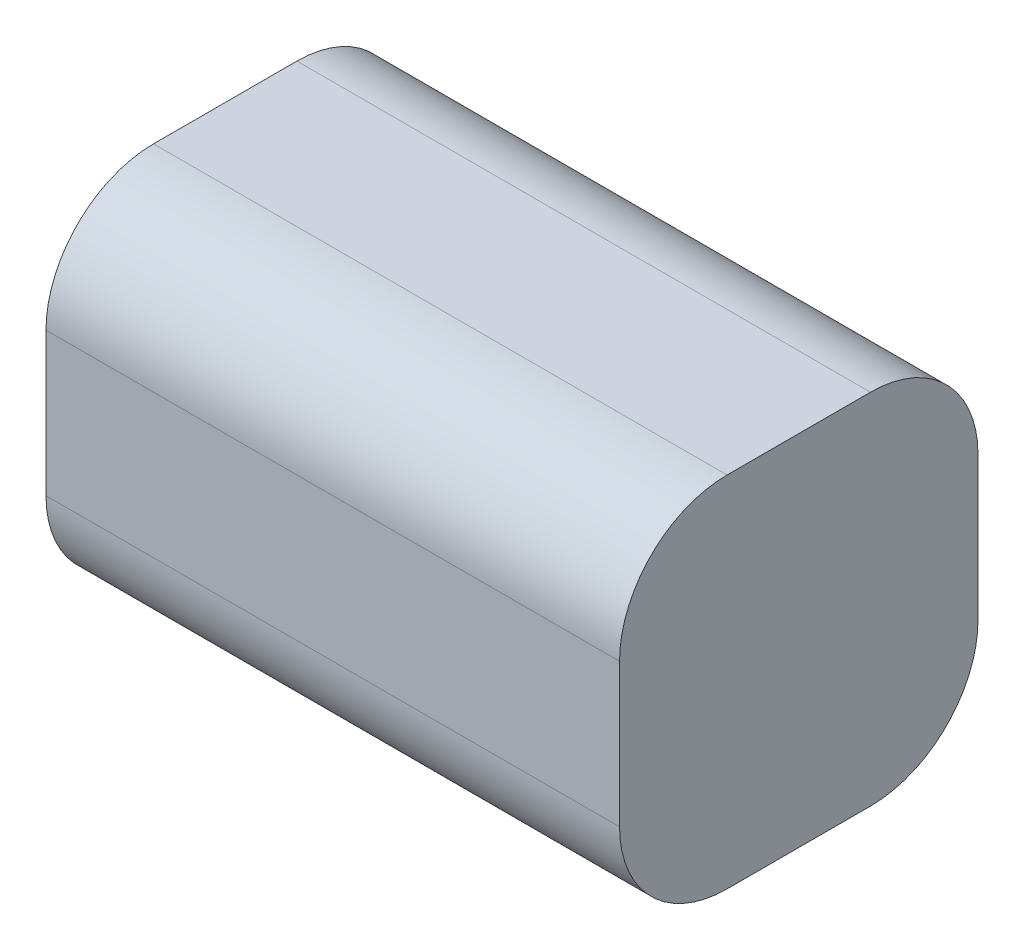
ISO-10303-21;
HEADER;
FILE_DESCRIPTION(('STEP AP214'),'2;1');
FILE_NAME('part.step','',(''),(''),'','','');
FILE_SCHEMA(('AUTOMOTIVE_DESIGN { 1 0 10303 214 1 1 1 1 }'));
ENDSEC;
DATA;
#1=APPLICATION_CONTEXT('core data for automotive mechanical design processes');
#2=APPLICATION_PROTOCOL_DEFINITION('international standard','automotive_design',2000,#1);
#3=PRODUCT_CONTEXT('',#1,'mechanical');
#4=PRODUCT('Part','Part','',(#3));
#5=PRODUCT_RELATED_PRODUCT_CATEGORY('part','',(#4));
#6=PRODUCT_DEFINITION_FORMATION('','',#4);
#7=PRODUCT_DEFINITION_CONTEXT('part definition',#1,'design');
#8=PRODUCT_DEFINITION('design','',#6,#7);
#9=PRODUCT_DEFINITION_SHAPE('','',#8);
#10=(LENGTH_UNIT() NAMED_UNIT(*) SI_UNIT(.MILLI.,.METRE.));
#11=(NAMED_UNIT(*) PLANE_ANGLE_UNIT() SI_UNIT($,.RADIAN.));
#12=(NAMED_UNIT(*) SI_UNIT($,.STERADIAN.) SOLID_ANGLE_UNIT());
#13=UNCERTAINTY_MEASURE_WITH_UNIT(LENGTH_MEASURE(1.E-05),#10,'distance_accuracy_value','');
#14=(GEOMETRIC_REPRESENTATION_CONTEXT(3) GLOBAL_UNCERTAINTY_ASSIGNED_CONTEXT((#13)) GLOBAL_UNIT_ASSIGNED_CONTEXT((#10,
#11,#12)) REPRESENTATION_CONTEXT('',''));
#15=CARTESIAN_POINT('',(0.,0.,0.));
#16=DIRECTION('',(0.,0.,1.));
#17=DIRECTION('',(1.,0.,0.));
#18=AXIS2_PLACEMENT_3D('',#15,#16,#17);
#19=CARTESIAN_POINT('',(8.,-5.,10.));
#20=DIRECTION('',(-1.,0.,0.));
#21=DIRECTION('',(0.,0.,1.));
#22=AXIS2_PLACEMENT_3D('',#19,#20,#21);
#23=PLANE('',#22);
#24=DIRECTION('',(0.,1.,0.));
#25=VECTOR('',#24,1.);
#26=CARTESIAN_POINT('',(8.,-5.,0.));
#27=LINE('',#26,#25);
#28=CARTESIAN_POINT('',(8.,-2.,0.));
#29=VERTEX_POINT('',#28);
#30=CARTESIAN_POINT('',(8.,2.,0.));
#31=VERTEX_POINT('',#30);
#32=EDGE_CURVE('E157',#29,#31,#27,.T.);
#33=ORIENTED_EDGE('',*,*,#32,.T.);
#34=CARTESIAN_POINT('',(8.,2.,3.));
#35=DIRECTION('',(-1.,0.,0.));
#36=DIRECTION('',(0.,0.,1.));
#37=AXIS2_PLACEMENT_3D('',#34,#35,#36);
#38=CIRCLE('',#37,3.);
#39=CARTESIAN_POINT('',(8.,5.,3.));
#40=VERTEX_POINT('',#39);
#41=EDGE_CURVE('E142',#31,#40,#38,.F.);
#42=ORIENTED_EDGE('',*,*,#41,.T.);
#43=DIRECTION('',(0.,0.,-1.));
#44=VECTOR('',#43,1.);
#45=CARTESIAN_POINT('',(8.,5.,10.));
#46=LINE('',#45,#44);
#47=CARTESIAN_POINT('',(8.,5.,7.));
#48=VERTEX_POINT('',#47);
#49=EDGE_CURVE('E121',#48,#40,#46,.T.);
#50=ORIENTED_EDGE('',*,*,#49,.F.);
#51=CARTESIAN_POINT('',(8.,2.,7.));
#52=DIRECTION('',(-1.,0.,0.));
#53=DIRECTION('',(0.,0.,1.));
#54=AXIS2_PLACEMENT_3D('',#51,#52,#53);
#55=CIRCLE('',#54,3.);
#56=CARTESIAN_POINT('',(8.,2.,10.));
#57=VERTEX_POINT('',#56);
#58=EDGE_CURVE('E125',#48,#57,#55,.F.);
#59=ORIENTED_EDGE('',*,*,#58,.T.);
#60=DIRECTION('',(0.,1.,0.));
#61=VECTOR('',#60,1.);
#62=CARTESIAN_POINT('',(8.,-5.,10.));
#63=LINE('',#62,#61);
#64=CARTESIAN_POINT('',(8.,-2.,10.));
#65=VERTEX_POINT('',#64);
#66=EDGE_CURVE('E151',#65,#57,#63,.T.);
#67=ORIENTED_EDGE('',*,*,#66,.F.);
#68=CARTESIAN_POINT('',(8.,-2.,7.));
#69=DIRECTION('',(-1.,0.,0.));
#70=DIRECTION('',(0.,0.,1.));
#71=AXIS2_PLACEMENT_3D('',#68,#69,#70);
#72=CIRCLE('',#71,3.);
#73=CARTESIAN_POINT('',(8.,-5.,7.));
#74=VERTEX_POINT('',#73);
#75=EDGE_CURVE('E57',#65,#74,#72,.F.);
#76=ORIENTED_EDGE('',*,*,#75,.T.);
#77=DIRECTION('',(0.,0.,-1.));
#78=VECTOR('',#77,1.);
#79=CARTESIAN_POINT('',(8.,-5.,10.));
#80=LINE('',#79,#78);
#81=CARTESIAN_POINT('',(8.,-5.,3.));
#82=VERTEX_POINT('',#81);
#83=EDGE_CURVE('E154',#74,#82,#80,.T.);
#84=ORIENTED_EDGE('',*,*,#83,.T.);
#85=CARTESIAN_POINT('',(8.,-2.,3.));
#86=DIRECTION('',(-1.,0.,0.));
#87=DIRECTION('',(0.,0.,1.));
#88=AXIS2_PLACEMENT_3D('',#85,#86,#87);
#89=CIRCLE('',#88,3.);
#90=EDGE_CURVE('E49',#82,#29,#89,.F.);
#91=ORIENTED_EDGE('',*,*,#90,.T.);
#92=EDGE_LOOP('',(#33,#42,#50,#59,#67,#76,#84,#91));
#93=FACE_BOUND('',#92,.T.);
#94=ADVANCED_FACE('F34',(#93),#23,.F.);
#95=CARTESIAN_POINT('',(-8.,5.,10.));
#96=DIRECTION('',(0.,-1.,0.));
#97=DIRECTION('',(1.,0.,0.));
#98=AXIS2_PLACEMENT_3D('',#95,#96,#97);
#99=PLANE('',#98);
#100=ORIENTED_EDGE('',*,*,#49,.T.);
#101=DIRECTION('',(-1.,0.,0.));
#102=VECTOR('',#101,1.);
#103=CARTESIAN_POINT('',(-8.,5.,3.));
#104=LINE('',#103,#102);
#105=CARTESIAN_POINT('',(-8.,5.,3.));
#106=VERTEX_POINT('',#105);
#107=EDGE_CURVE('E112',#40,#106,#104,.T.);
#108=ORIENTED_EDGE('',*,*,#107,.T.);
#109=DIRECTION('',(0.,0.,-1.));
#110=VECTOR('',#109,1.);
#111=CARTESIAN_POINT('',(-8.,5.,10.));
#112=LINE('',#111,#110);
#113=CARTESIAN_POINT('',(-8.,5.,7.));
#114=VERTEX_POINT('',#113);
#115=EDGE_CURVE('E104',#114,#106,#112,.T.);
#116=ORIENTED_EDGE('',*,*,#115,.F.);
#117=DIRECTION('',(-1.,0.,0.));
#118=VECTOR('',#117,1.);
#119=CARTESIAN_POINT('',(-8.,5.,7.));
#120=LINE('',#119,#118);
#121=EDGE_CURVE('E118',#114,#48,#120,.F.);
#122=ORIENTED_EDGE('',*,*,#121,.T.);
#123=EDGE_LOOP('',(#100,#108,#116,#122));
#124=FACE_BOUND('',#123,.T.);
#125=ADVANCED_FACE('F117',(#124),#99,.F.);
#126=CARTESIAN_POINT('',(-8.,-5.,10.));
#127=DIRECTION('',(1.,0.,0.));
#128=DIRECTION('',(0.,0.,-1.));
#129=AXIS2_PLACEMENT_3D('',#126,#127,#128);
#130=PLANE('',#129);
#131=ORIENTED_EDGE('',*,*,#115,.T.);
#132=CARTESIAN_POINT('',(-8.,2.,3.));
#133=DIRECTION('',(1.,0.,0.));
#134=DIRECTION('',(0.,0.,-1.));
#135=AXIS2_PLACEMENT_3D('',#132,#133,#134);
#136=CIRCLE('',#135,3.);
#137=CARTESIAN_POINT('',(-8.,2.,0.));
#138=VERTEX_POINT('',#137);
#139=EDGE_CURVE('E133',#106,#138,#136,.F.);
#140=ORIENTED_EDGE('',*,*,#139,.T.);
#141=DIRECTION('',(0.,-1.,0.));
#142=VECTOR('',#141,1.);
#143=CARTESIAN_POINT('',(-8.,-5.,0.));
#144=LINE('',#143,#142);
#145=CARTESIAN_POINT('',(-8.,-2.,0.));
#146=VERTEX_POINT('',#145);
#147=EDGE_CURVE('E152',#138,#146,#144,.T.);
#148=ORIENTED_EDGE('',*,*,#147,.T.);
#149=CARTESIAN_POINT('',(-8.,-2.,3.));
#150=DIRECTION('',(1.,0.,0.));
#151=DIRECTION('',(0.,0.,-1.));
#152=AXIS2_PLACEMENT_3D('',#149,#150,#151);
#153=CIRCLE('',#152,3.);
#154=CARTESIAN_POINT('',(-8.,-5.,3.));
#155=VERTEX_POINT('',#154);
#156=EDGE_CURVE('E131',#146,#155,#153,.F.);
#157=ORIENTED_EDGE('',*,*,#156,.T.);
#158=DIRECTION('',(0.,0.,-1.));
#159=VECTOR('',#158,1.);
#160=CARTESIAN_POINT('',(-8.,-5.,10.));
#161=LINE('',#160,#159);
#162=CARTESIAN_POINT('',(-8.,-5.,7.));
#163=VERTEX_POINT('',#162);
#164=EDGE_CURVE('E122',#163,#155,#161,.T.);
#165=ORIENTED_EDGE('',*,*,#164,.F.);
#166=CARTESIAN_POINT('',(-8.,-2.,7.));
#167=DIRECTION('',(1.,0.,0.));
#168=DIRECTION('',(0.,0.,-1.));
#169=AXIS2_PLACEMENT_3D('',#166,#167,#168);
#170=CIRCLE('',#169,3.);
#171=CARTESIAN_POINT('',(-8.,-2.,10.));
#172=VERTEX_POINT('',#171);
#173=EDGE_CURVE('E111',#163,#172,#170,.F.);
#174=ORIENTED_EDGE('',*,*,#173,.T.);
#175=DIRECTION('',(0.,-1.,0.));
#176=VECTOR('',#175,1.);
#177=CARTESIAN_POINT('',(-8.,-5.,10.));
#178=LINE('',#177,#176);
#179=CARTESIAN_POINT('',(-8.,2.,10.));
#180=VERTEX_POINT('',#179);
#181=EDGE_CURVE('E106',#180,#172,#178,.T.);
#182=ORIENTED_EDGE('',*,*,#181,.F.);
#183=CARTESIAN_POINT('',(-8.,2.,7.));
#184=DIRECTION('',(1.,0.,0.));
#185=DIRECTION('',(0.,0.,-1.));
#186=AXIS2_PLACEMENT_3D('',#183,#184,#185);
#187=CIRCLE('',#186,3.);
#188=EDGE_CURVE('E101',#180,#114,#187,.F.);
#189=ORIENTED_EDGE('',*,*,#188,.T.);
#190=EDGE_LOOP('',(#131,#140,#148,#157,#165,#174,#182,#189));
#191=FACE_BOUND('',#190,.T.);
#192=ADVANCED_FACE('F103',(#191),#130,.F.);
#193=CARTESIAN_POINT('',(-8.,-5.,10.));
#194=DIRECTION('',(0.,1.,0.));
#195=DIRECTION('',(-1.,0.,0.));
#196=AXIS2_PLACEMENT_3D('',#193,#194,#195);
#197=PLANE('',#196);
#198=ORIENTED_EDGE('',*,*,#164,.T.);
#199=DIRECTION('',(1.,0.,0.));
#200=VECTOR('',#199,1.);
#201=CARTESIAN_POINT('',(8.,-5.,3.));
#202=LINE('',#201,#200);
#203=EDGE_CURVE('E146',#155,#82,#202,.T.);
#204=ORIENTED_EDGE('',*,*,#203,.T.);
#205=ORIENTED_EDGE('',*,*,#83,.F.);
#206=DIRECTION('',(1.,0.,0.));
#207=VECTOR('',#206,1.);
#208=CARTESIAN_POINT('',(-8.,-5.,7.));
#209=LINE('',#208,#207);
#210=EDGE_CURVE('E144',#74,#163,#209,.F.);
#211=ORIENTED_EDGE('',*,*,#210,.T.);
#212=EDGE_LOOP('',(#198,#204,#205,#211));
#213=FACE_BOUND('',#212,.T.);
#214=ADVANCED_FACE('F166',(#213),#197,.F.);
#215=CARTESIAN_POINT('',(0.,0.,10.));
#216=DIRECTION('',(0.,0.,-1.));
#217=DIRECTION('',(-1.,0.,0.));
#218=AXIS2_PLACEMENT_3D('',#215,#216,#217);
#219=PLANE('',#218);
#220=ORIENTED_EDGE('',*,*,#181,.T.);
#221=DIRECTION('',(1.,0.,0.));
#222=VECTOR('',#221,1.);
#223=CARTESIAN_POINT('',(0.,-2.,10.));
#224=LINE('',#223,#222);
#225=EDGE_CURVE('E11',#172,#65,#224,.T.);
#226=ORIENTED_EDGE('',*,*,#225,.T.);
#227=ORIENTED_EDGE('',*,*,#66,.T.);
#228=DIRECTION('',(-1.,0.,0.));
#229=VECTOR('',#228,1.);
#230=CARTESIAN_POINT('',(0.,2.,10.));
#231=LINE('',#230,#229);
#232=EDGE_CURVE('E42',#57,#180,#231,.T.);
#233=ORIENTED_EDGE('',*,*,#232,.T.);
#234=EDGE_LOOP('',(#220,#226,#227,#233));
#235=FACE_BOUND('',#234,.T.);
#236=ADVANCED_FACE('F149',(#235),#219,.F.);
#237=CARTESIAN_POINT('',(0.,0.,0.));
#238=DIRECTION('',(0.,0.,-1.));
#239=DIRECTION('',(-1.,0.,0.));
#240=AXIS2_PLACEMENT_3D('',#237,#238,#239);
#241=PLANE('',#240);
#242=ORIENTED_EDGE('',*,*,#147,.F.);
#243=DIRECTION('',(-1.,0.,0.));
#244=VECTOR('',#243,1.);
#245=CARTESIAN_POINT('',(8.,2.,0.));
#246=LINE('',#245,#244);
#247=EDGE_CURVE('E137',#138,#31,#246,.F.);
#248=ORIENTED_EDGE('',*,*,#247,.T.);
#249=ORIENTED_EDGE('',*,*,#32,.F.);
#250=DIRECTION('',(1.,0.,0.));
#251=VECTOR('',#250,1.);
#252=CARTESIAN_POINT('',(-8.,-2.,0.));
#253=LINE('',#252,#251);
#254=EDGE_CURVE('E135',#29,#146,#253,.F.);
#255=ORIENTED_EDGE('',*,*,#254,.T.);
#256=EDGE_LOOP('',(#242,#248,#249,#255));
#257=FACE_BOUND('',#256,.T.);
#258=ADVANCED_FACE('F174',(#257),#241,.T.);
#259=CARTESIAN_POINT('',(-8.,2.,3.));
#260=DIRECTION('',(1.,0.,0.));
#261=DIRECTION('',(0.,1.,0.));
#262=AXIS2_PLACEMENT_3D('',#259,#260,#261);
#263=CYLINDRICAL_SURFACE('',#262,3.);
#264=ORIENTED_EDGE('',*,*,#41,.F.);
#265=ORIENTED_EDGE('',*,*,#247,.F.);
#266=ORIENTED_EDGE('',*,*,#139,.F.);
#267=ORIENTED_EDGE('',*,*,#107,.F.);
#268=EDGE_LOOP('',(#264,#265,#266,#267));
#269=FACE_BOUND('',#268,.T.);
#270=ADVANCED_FACE('F178',(#269),#263,.T.);
#271=CARTESIAN_POINT('',(-8.,-2.,3.));
#272=DIRECTION('',(-1.,0.,0.));
#273=DIRECTION('',(0.,-1.,0.));
#274=AXIS2_PLACEMENT_3D('',#271,#272,#273);
#275=CYLINDRICAL_SURFACE('',#274,3.);
#276=ORIENTED_EDGE('',*,*,#156,.F.);
#277=ORIENTED_EDGE('',*,*,#254,.F.);
#278=ORIENTED_EDGE('',*,*,#90,.F.);
#279=ORIENTED_EDGE('',*,*,#203,.F.);
#280=EDGE_LOOP('',(#276,#277,#278,#279));
#281=FACE_BOUND('',#280,.T.);
#282=ADVANCED_FACE('F170',(#281),#275,.T.);
#283=CARTESIAN_POINT('',(0.,-2.,7.));
#284=DIRECTION('',(1.,0.,0.));
#285=DIRECTION('',(0.,1.,0.));
#286=AXIS2_PLACEMENT_3D('',#283,#284,#285);
#287=CYLINDRICAL_SURFACE('',#286,3.);
#288=ORIENTED_EDGE('',*,*,#173,.F.);
#289=ORIENTED_EDGE('',*,*,#210,.F.);
#290=ORIENTED_EDGE('',*,*,#75,.F.);
#291=ORIENTED_EDGE('',*,*,#225,.F.);
#292=EDGE_LOOP('',(#288,#289,#290,#291));
#293=FACE_BOUND('',#292,.T.);
#294=ADVANCED_FACE('F180',(#293),#287,.T.);
#295=CARTESIAN_POINT('',(0.,2.,7.));
#296=DIRECTION('',(-1.,0.,0.));
#297=DIRECTION('',(0.,-1.,0.));
#298=AXIS2_PLACEMENT_3D('',#295,#296,#297);
#299=CYLINDRICAL_SURFACE('',#298,3.);
#300=ORIENTED_EDGE('',*,*,#58,.F.);
#301=ORIENTED_EDGE('',*,*,#121,.F.);
#302=ORIENTED_EDGE('',*,*,#188,.F.);
#303=ORIENTED_EDGE('',*,*,#232,.F.);
#304=EDGE_LOOP('',(#300,#301,#302,#303));
#305=FACE_BOUND('',#304,.T.);
#306=ADVANCED_FACE('F36',(#305),#299,.T.);
#307=CLOSED_SHELL('',(#94,#125,#192,#214,#236,#258,#270,#282,#294,#306));
#308=MANIFOLD_SOLID_BREP('B2',#307);
#309=ADVANCED_BREP_SHAPE_REPRESENTATION('',(#18,#308),#14);
#310=SHAPE_DEFINITION_REPRESENTATION(#9,#309);
ENDSEC;
END-ISO-10303-21;
